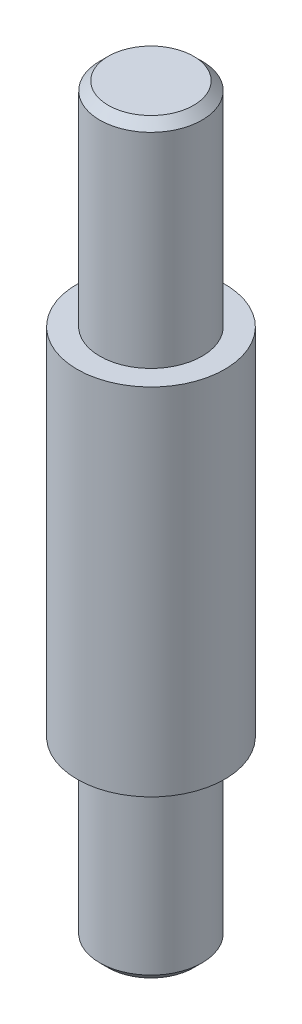
ISO-10303-21;
HEADER;
FILE_DESCRIPTION(('STEP AP214'),'2;1');
FILE_NAME('part.step','',(''),(''),'','','');
FILE_SCHEMA(('AUTOMOTIVE_DESIGN { 1 0 10303 214 1 1 1 1 }'));
ENDSEC;
DATA;
#1=APPLICATION_CONTEXT('core data for automotive mechanical design processes');
#2=APPLICATION_PROTOCOL_DEFINITION('international standard','automotive_design',2000,#1);
#3=PRODUCT_CONTEXT('',#1,'mechanical');
#4=PRODUCT('Part','Part','',(#3));
#5=PRODUCT_RELATED_PRODUCT_CATEGORY('part','',(#4));
#6=PRODUCT_DEFINITION_FORMATION('','',#4);
#7=PRODUCT_DEFINITION_CONTEXT('part definition',#1,'design');
#8=PRODUCT_DEFINITION('design','',#6,#7);
#9=PRODUCT_DEFINITION_SHAPE('','',#8);
#10=(LENGTH_UNIT() NAMED_UNIT(*) SI_UNIT(.MILLI.,.METRE.));
#11=(NAMED_UNIT(*) PLANE_ANGLE_UNIT() SI_UNIT($,.RADIAN.));
#12=(NAMED_UNIT(*) SI_UNIT($,.STERADIAN.) SOLID_ANGLE_UNIT());
#13=UNCERTAINTY_MEASURE_WITH_UNIT(LENGTH_MEASURE(1.E-05),#10,'distance_accuracy_value','');
#14=(GEOMETRIC_REPRESENTATION_CONTEXT(3) GLOBAL_UNCERTAINTY_ASSIGNED_CONTEXT((#13)) GLOBAL_UNIT_ASSIGNED_CONTEXT((#10,
#11,#12)) REPRESENTATION_CONTEXT('',''));
#15=CARTESIAN_POINT('',(0.,0.,0.));
#16=DIRECTION('',(0.,0.,1.));
#17=DIRECTION('',(1.,0.,0.));
#18=AXIS2_PLACEMENT_3D('',#15,#16,#17);
#19=CARTESIAN_POINT('',(0.,33.401,0.));
#20=DIRECTION('',(0.,1.,0.));
#21=DIRECTION('',(0.,0.,1.));
#22=AXIS2_PLACEMENT_3D('',#19,#20,#21);
#23=PLANE('',#22);
#24=CARTESIAN_POINT('',(0.,33.401,0.));
#25=DIRECTION('',(0.,1.,0.));
#26=DIRECTION('',(0.,0.,1.));
#27=AXIS2_PLACEMENT_3D('',#24,#25,#26);
#28=CIRCLE('',#27,3.81);
#29=CARTESIAN_POINT('',(0.,33.401,3.81));
#30=VERTEX_POINT('',#29);
#31=EDGE_CURVE('E10',#30,#30,#28,.T.);
#32=ORIENTED_EDGE('',*,*,#31,.T.);
#33=EDGE_LOOP('',(#32));
#34=FACE_BOUND('',#33,.T.);
#35=ADVANCED_FACE('F43',(#34),#23,.T.);
#36=CARTESIAN_POINT('',(0.,33.401,0.));
#37=DIRECTION('',(0.,-1.,0.));
#38=DIRECTION('',(0.,0.,-1.));
#39=AXIS2_PLACEMENT_3D('',#36,#37,#38);
#40=CONICAL_SURFACE('',#39,3.81,0.785398163397449);
#41=CARTESIAN_POINT('',(0.,32.639,0.));
#42=DIRECTION('',(0.,1.,0.));
#43=DIRECTION('',(0.,0.,1.));
#44=AXIS2_PLACEMENT_3D('',#41,#42,#43);
#45=CIRCLE('',#44,4.572);
#46=CARTESIAN_POINT('',(0.,32.639,4.572));
#47=VERTEX_POINT('',#46);
#48=EDGE_CURVE('E50',#47,#47,#45,.T.);
#49=ORIENTED_EDGE('',*,*,#48,.T.);
#50=EDGE_LOOP('',(#49));
#51=FACE_BOUND('',#50,.T.);
#52=ORIENTED_EDGE('',*,*,#31,.F.);
#53=EDGE_LOOP('',(#52));
#54=FACE_BOUND('',#53,.T.);
#55=ADVANCED_FACE('F95',(#51,#54),#40,.T.);
#56=CARTESIAN_POINT('',(0.,33.401,0.));
#57=DIRECTION('',(0.,1.,0.));
#58=DIRECTION('',(0.,0.,1.));
#59=AXIS2_PLACEMENT_3D('',#56,#57,#58);
#60=CYLINDRICAL_SURFACE('',#59,4.572);
#61=CARTESIAN_POINT('',(0.,14.351,0.));
#62=DIRECTION('',(0.,1.,0.));
#63=DIRECTION('',(0.,0.,1.));
#64=AXIS2_PLACEMENT_3D('',#61,#62,#63);
#65=CIRCLE('',#64,4.572);
#66=CARTESIAN_POINT('',(0.,14.351,4.572));
#67=VERTEX_POINT('',#66);
#68=EDGE_CURVE('E55',#67,#67,#65,.T.);
#69=ORIENTED_EDGE('',*,*,#68,.T.);
#70=EDGE_LOOP('',(#69));
#71=FACE_BOUND('',#70,.T.);
#72=ORIENTED_EDGE('',*,*,#48,.F.);
#73=EDGE_LOOP('',(#72));
#74=FACE_BOUND('',#73,.T.);
#75=ADVANCED_FACE('F99',(#71,#74),#60,.T.);
#76=CARTESIAN_POINT('',(0.,14.351,4.572));
#77=DIRECTION('',(0.,1.,0.));
#78=DIRECTION('',(0.,0.,1.));
#79=AXIS2_PLACEMENT_3D('',#76,#77,#78);
#80=PLANE('',#79);
#81=CARTESIAN_POINT('',(0.,14.351,0.));
#82=DIRECTION('',(0.,1.,0.));
#83=DIRECTION('',(0.,0.,1.));
#84=AXIS2_PLACEMENT_3D('',#81,#82,#83);
#85=CIRCLE('',#84,6.604);
#86=CARTESIAN_POINT('',(0.,14.351,6.604));
#87=VERTEX_POINT('',#86);
#88=EDGE_CURVE('E60',#87,#87,#85,.T.);
#89=ORIENTED_EDGE('',*,*,#88,.T.);
#90=EDGE_LOOP('',(#89));
#91=FACE_BOUND('',#90,.T.);
#92=ORIENTED_EDGE('',*,*,#68,.F.);
#93=EDGE_LOOP('',(#92));
#94=FACE_BOUND('',#93,.T.);
#95=ADVANCED_FACE('F103',(#91,#94),#80,.T.);
#96=CARTESIAN_POINT('',(0.,33.401,0.));
#97=DIRECTION('',(0.,1.,0.));
#98=DIRECTION('',(0.,0.,1.));
#99=AXIS2_PLACEMENT_3D('',#96,#97,#98);
#100=CYLINDRICAL_SURFACE('',#99,6.604);
#101=CARTESIAN_POINT('',(0.,-17.399,0.));
#102=DIRECTION('',(0.,1.,0.));
#103=DIRECTION('',(0.,0.,1.));
#104=AXIS2_PLACEMENT_3D('',#101,#102,#103);
#105=CIRCLE('',#104,6.604);
#106=CARTESIAN_POINT('',(0.,-17.399,6.604));
#107=VERTEX_POINT('',#106);
#108=EDGE_CURVE('E66',#107,#107,#105,.T.);
#109=ORIENTED_EDGE('',*,*,#108,.T.);
#110=EDGE_LOOP('',(#109));
#111=FACE_BOUND('',#110,.T.);
#112=ORIENTED_EDGE('',*,*,#88,.F.);
#113=EDGE_LOOP('',(#112));
#114=FACE_BOUND('',#113,.T.);
#115=ADVANCED_FACE('F110',(#111,#114),#100,.T.);
#116=CARTESIAN_POINT('',(0.,-17.399,6.604));
#117=DIRECTION('',(0.,-1.,0.));
#118=DIRECTION('',(0.,0.,-1.));
#119=AXIS2_PLACEMENT_3D('',#116,#117,#118);
#120=PLANE('',#119);
#121=CARTESIAN_POINT('',(0.,-17.399,0.));
#122=DIRECTION('',(0.,1.,0.));
#123=DIRECTION('',(0.,0.,1.));
#124=AXIS2_PLACEMENT_3D('',#121,#122,#123);
#125=CIRCLE('',#124,4.572);
#126=CARTESIAN_POINT('',(0.,-17.399,4.572));
#127=VERTEX_POINT('',#126);
#128=EDGE_CURVE('E70',#127,#127,#125,.T.);
#129=ORIENTED_EDGE('',*,*,#128,.T.);
#130=EDGE_LOOP('',(#129));
#131=FACE_BOUND('',#130,.T.);
#132=ORIENTED_EDGE('',*,*,#108,.F.);
#133=EDGE_LOOP('',(#132));
#134=FACE_BOUND('',#133,.T.);
#135=ADVANCED_FACE('F114',(#131,#134),#120,.T.);
#136=CARTESIAN_POINT('',(0.,33.401,0.));
#137=DIRECTION('',(0.,1.,0.));
#138=DIRECTION('',(0.,0.,1.));
#139=AXIS2_PLACEMENT_3D('',#136,#137,#138);
#140=CYLINDRICAL_SURFACE('',#139,4.572);
#141=CARTESIAN_POINT('',(0.,-32.639,0.));
#142=DIRECTION('',(0.,1.,0.));
#143=DIRECTION('',(0.,0.,1.));
#144=AXIS2_PLACEMENT_3D('',#141,#142,#143);
#145=CIRCLE('',#144,4.572);
#146=CARTESIAN_POINT('',(0.,-32.639,4.572));
#147=VERTEX_POINT('',#146);
#148=EDGE_CURVE('E74',#147,#147,#145,.T.);
#149=ORIENTED_EDGE('',*,*,#148,.T.);
#150=EDGE_LOOP('',(#149));
#151=FACE_BOUND('',#150,.T.);
#152=ORIENTED_EDGE('',*,*,#128,.F.);
#153=EDGE_LOOP('',(#152));
#154=FACE_BOUND('',#153,.T.);
#155=ADVANCED_FACE('F92',(#151,#154),#140,.T.);
#156=CARTESIAN_POINT('',(0.,-32.639,0.));
#157=DIRECTION('',(0.,1.,0.));
#158=DIRECTION('',(0.,0.,1.));
#159=AXIS2_PLACEMENT_3D('',#156,#157,#158);
#160=CONICAL_SURFACE('',#159,4.572,0.785398163397444);
#161=CARTESIAN_POINT('',(0.,-33.401,0.));
#162=DIRECTION('',(0.,1.,0.));
#163=DIRECTION('',(0.,0.,1.));
#164=AXIS2_PLACEMENT_3D('',#161,#162,#163);
#165=CIRCLE('',#164,3.81000000000001);
#166=CARTESIAN_POINT('',(0.,-33.401,3.81000000000001));
#167=VERTEX_POINT('',#166);
#168=EDGE_CURVE('E78',#167,#167,#165,.T.);
#169=ORIENTED_EDGE('',*,*,#168,.T.);
#170=EDGE_LOOP('',(#169));
#171=FACE_BOUND('',#170,.T.);
#172=ORIENTED_EDGE('',*,*,#148,.F.);
#173=EDGE_LOOP('',(#172));
#174=FACE_BOUND('',#173,.T.);
#175=ADVANCED_FACE('F83',(#171,#174),#160,.T.);
#176=CARTESIAN_POINT('',(0.,-33.401,3.81000000000001));
#177=DIRECTION('',(0.,-1.,0.));
#178=DIRECTION('',(0.,0.,-1.));
#179=AXIS2_PLACEMENT_3D('',#176,#177,#178);
#180=PLANE('',#179);
#181=ORIENTED_EDGE('',*,*,#168,.F.);
#182=EDGE_LOOP('',(#181));
#183=FACE_BOUND('',#182,.T.);
#184=ADVANCED_FACE('F86',(#183),#180,.T.);
#185=CLOSED_SHELL('',(#35,#55,#75,#95,#115,#135,#155,#175,#184));
#186=MANIFOLD_SOLID_BREP('B2',#185);
#187=ADVANCED_BREP_SHAPE_REPRESENTATION('',(#18,#186),#14);
#188=SHAPE_DEFINITION_REPRESENTATION(#9,#187);
ENDSEC;
END-ISO-10303-21;
